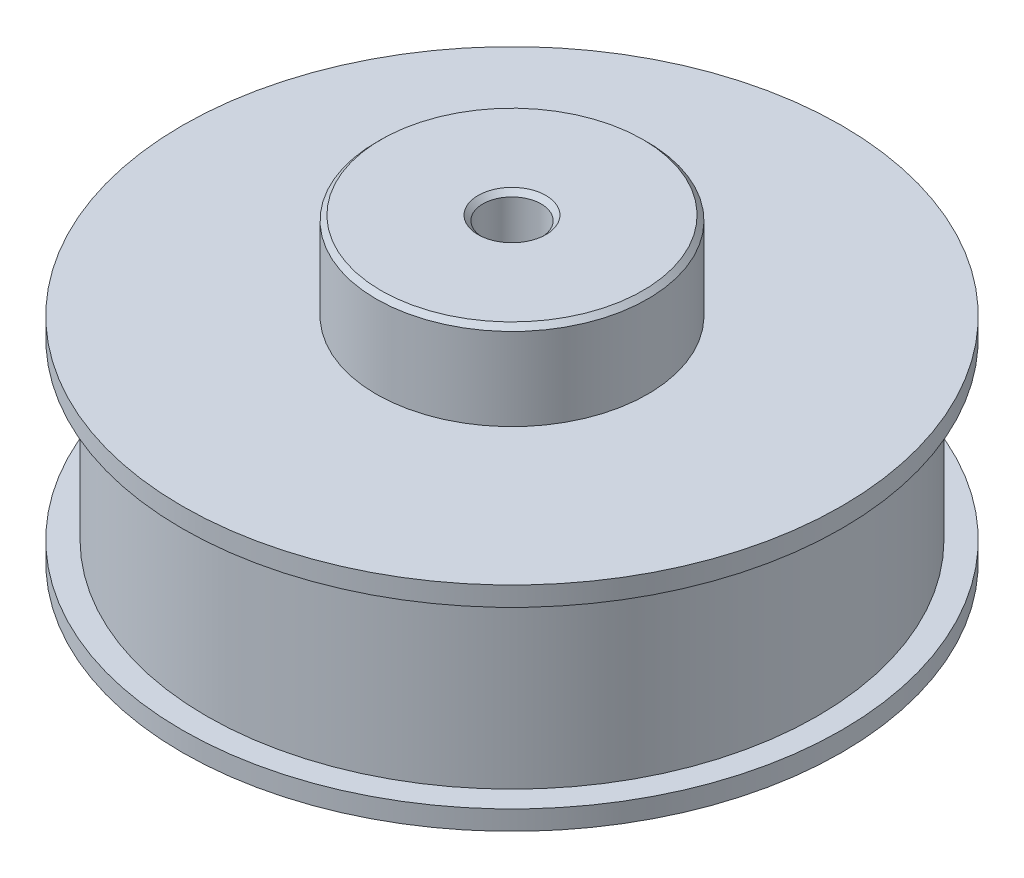
ISO-10303-21;
HEADER;
FILE_DESCRIPTION(('STEP AP214'),'2;1');
FILE_NAME('part.step','',(''),(''),'','','');
FILE_SCHEMA(('AUTOMOTIVE_DESIGN { 1 0 10303 214 1 1 1 1 }'));
ENDSEC;
DATA;
#1=APPLICATION_CONTEXT('core data for automotive mechanical design processes');
#2=APPLICATION_PROTOCOL_DEFINITION('international standard','automotive_design',2000,#1);
#3=PRODUCT_CONTEXT('',#1,'mechanical');
#4=PRODUCT('Part','Part','',(#3));
#5=PRODUCT_RELATED_PRODUCT_CATEGORY('part','',(#4));
#6=PRODUCT_DEFINITION_FORMATION('','',#4);
#7=PRODUCT_DEFINITION_CONTEXT('part definition',#1,'design');
#8=PRODUCT_DEFINITION('design','',#6,#7);
#9=PRODUCT_DEFINITION_SHAPE('','',#8);
#10=(LENGTH_UNIT() NAMED_UNIT(*) SI_UNIT(.MILLI.,.METRE.));
#11=(NAMED_UNIT(*) PLANE_ANGLE_UNIT() SI_UNIT($,.RADIAN.));
#12=(NAMED_UNIT(*) SI_UNIT($,.STERADIAN.) SOLID_ANGLE_UNIT());
#13=UNCERTAINTY_MEASURE_WITH_UNIT(LENGTH_MEASURE(1.E-05),#10,'distance_accuracy_value','');
#14=(GEOMETRIC_REPRESENTATION_CONTEXT(3) GLOBAL_UNCERTAINTY_ASSIGNED_CONTEXT((#13)) GLOBAL_UNIT_ASSIGNED_CONTEXT((#10,
#11,#12)) REPRESENTATION_CONTEXT('',''));
#15=CARTESIAN_POINT('',(0.,0.,0.));
#16=DIRECTION('',(0.,0.,1.));
#17=DIRECTION('',(1.,0.,0.));
#18=AXIS2_PLACEMENT_3D('',#15,#16,#17);
#19=CARTESIAN_POINT('',(0.,22.,0.));
#20=DIRECTION('',(0.,-1.,0.));
#21=DIRECTION('',(0.,0.,-1.));
#22=AXIS2_PLACEMENT_3D('',#19,#20,#21);
#23=CYLINDRICAL_SURFACE('',#22,34.);
#24=CARTESIAN_POINT('',(0.,20.,0.));
#25=DIRECTION('',(0.,1.,0.));
#26=DIRECTION('',(0.,0.,1.));
#27=AXIS2_PLACEMENT_3D('',#24,#25,#26);
#28=CIRCLE('',#27,34.);
#29=CARTESIAN_POINT('',(0.,20.,34.));
#30=VERTEX_POINT('',#29);
#31=EDGE_CURVE('E64',#30,#30,#28,.T.);
#32=ORIENTED_EDGE('',*,*,#31,.T.);
#33=EDGE_LOOP('',(#32));
#34=FACE_BOUND('',#33,.T.);
#35=CARTESIAN_POINT('',(0.,22.,0.));
#36=DIRECTION('',(0.,1.,0.));
#37=DIRECTION('',(0.,0.,1.));
#38=AXIS2_PLACEMENT_3D('',#35,#36,#37);
#39=CIRCLE('',#38,34.);
#40=CARTESIAN_POINT('',(0.,22.,34.));
#41=VERTEX_POINT('',#40);
#42=EDGE_CURVE('E54',#41,#41,#39,.T.);
#43=ORIENTED_EDGE('',*,*,#42,.F.);
#44=EDGE_LOOP('',(#43));
#45=FACE_BOUND('',#44,.T.);
#46=ADVANCED_FACE('F34',(#34,#45),#23,.T.);
#47=CARTESIAN_POINT('',(0.,22.,0.));
#48=DIRECTION('',(0.,1.,0.));
#49=DIRECTION('',(0.,0.,1.));
#50=AXIS2_PLACEMENT_3D('',#47,#48,#49);
#51=PLANE('',#50);
#52=CARTESIAN_POINT('',(0.,22.,0.));
#53=DIRECTION('',(0.,1.,0.));
#54=DIRECTION('',(0.,0.,1.));
#55=AXIS2_PLACEMENT_3D('',#52,#53,#54);
#56=CIRCLE('',#55,14.);
#57=CARTESIAN_POINT('',(0.,22.,14.));
#58=VERTEX_POINT('',#57);
#59=EDGE_CURVE('E70',#58,#58,#56,.T.);
#60=ORIENTED_EDGE('',*,*,#59,.F.);
#61=EDGE_LOOP('',(#60));
#62=FACE_BOUND('',#61,.T.);
#63=ORIENTED_EDGE('',*,*,#42,.T.);
#64=EDGE_LOOP('',(#63));
#65=FACE_BOUND('',#64,.T.);
#66=ADVANCED_FACE('F109',(#62,#65),#51,.T.);
#67=CARTESIAN_POINT('',(0.,20.,0.));
#68=DIRECTION('',(0.,1.,0.));
#69=DIRECTION('',(0.,0.,1.));
#70=AXIS2_PLACEMENT_3D('',#67,#68,#69);
#71=PLANE('',#70);
#72=CARTESIAN_POINT('',(0.,20.,0.));
#73=DIRECTION('',(0.,1.,0.));
#74=DIRECTION('',(0.,0.,1.));
#75=AXIS2_PLACEMENT_3D('',#72,#73,#74);
#76=CIRCLE('',#75,31.5);
#77=CARTESIAN_POINT('',(0.,20.,31.5));
#78=VERTEX_POINT('',#77);
#79=EDGE_CURVE('E67',#78,#78,#76,.T.);
#80=ORIENTED_EDGE('',*,*,#79,.T.);
#81=EDGE_LOOP('',(#80));
#82=FACE_BOUND('',#81,.T.);
#83=ORIENTED_EDGE('',*,*,#31,.F.);
#84=EDGE_LOOP('',(#83));
#85=FACE_BOUND('',#84,.T.);
#86=ADVANCED_FACE('F103',(#82,#85),#71,.F.);
#87=CARTESIAN_POINT('',(0.,-96.1665222413705,0.));
#88=DIRECTION('',(0.,1.,0.));
#89=DIRECTION('',(0.,0.,1.));
#90=AXIS2_PLACEMENT_3D('',#87,#88,#89);
#91=CYLINDRICAL_SURFACE('',#90,31.5);
#92=CARTESIAN_POINT('',(0.,2.,0.));
#93=DIRECTION('',(0.,1.,0.));
#94=DIRECTION('',(0.,0.,1.));
#95=AXIS2_PLACEMENT_3D('',#92,#93,#94);
#96=CIRCLE('',#95,31.5);
#97=CARTESIAN_POINT('',(0.,1.99999999999999,31.5));
#98=VERTEX_POINT('',#97);
#99=EDGE_CURVE('E58',#98,#98,#96,.F.);
#100=CARTESIAN_POINT('',(0.,1.99999999999999,31.5));
#101=CARTESIAN_POINT('',(0.,2.18749999999999,31.5));
#102=CARTESIAN_POINT('',(0.,2.37499999999998,31.5));
#103=CARTESIAN_POINT('',(0.,2.74999999999998,31.5));
#104=CARTESIAN_POINT('',(0.,2.93749999999999,31.5));
#105=CARTESIAN_POINT('',(0.,3.31249999999999,31.5));
#106=CARTESIAN_POINT('',(0.,3.49999999999999,31.5));
#107=CARTESIAN_POINT('',(0.,3.87499999999999,31.5));
#108=CARTESIAN_POINT('',(0.,4.06249999999999,31.5));
#109=CARTESIAN_POINT('',(0.,4.43749999999999,31.5));
#110=CARTESIAN_POINT('',(0.,4.62499999999999,31.5));
#111=CARTESIAN_POINT('',(0.,4.99999999999999,31.5));
#112=CARTESIAN_POINT('',(0.,5.18749999999999,31.5));
#113=CARTESIAN_POINT('',(0.,5.56249999999999,31.5));
#114=CARTESIAN_POINT('',(0.,5.75,31.5));
#115=CARTESIAN_POINT('',(0.,6.125,31.5));
#116=CARTESIAN_POINT('',(0.,6.31249999999999,31.5));
#117=CARTESIAN_POINT('',(0.,6.68749999999999,31.5));
#118=CARTESIAN_POINT('',(0.,6.87499999999999,31.5));
#119=CARTESIAN_POINT('',(0.,7.24999999999999,31.5));
#120=CARTESIAN_POINT('',(0.,7.43749999999999,31.5));
#121=CARTESIAN_POINT('',(0.,7.8125,31.5));
#122=CARTESIAN_POINT('',(0.,8.,31.5));
#123=CARTESIAN_POINT('',(0.,8.375,31.5));
#124=CARTESIAN_POINT('',(0.,8.56249999999999,31.5));
#125=CARTESIAN_POINT('',(0.,8.93749999999999,31.5));
#126=CARTESIAN_POINT('',(0.,9.12499999999999,31.5));
#127=CARTESIAN_POINT('',(0.,9.49999999999999,31.5));
#128=CARTESIAN_POINT('',(0.,9.68749999999999,31.5));
#129=CARTESIAN_POINT('',(0.,10.0625,31.5));
#130=CARTESIAN_POINT('',(0.,10.25,31.5));
#131=CARTESIAN_POINT('',(0.,10.625,31.5));
#132=CARTESIAN_POINT('',(0.,10.8125,31.5));
#133=CARTESIAN_POINT('',(0.,11.1875,31.5));
#134=CARTESIAN_POINT('',(0.,11.375,31.5));
#135=CARTESIAN_POINT('',(0.,11.75,31.5));
#136=CARTESIAN_POINT('',(0.,11.9375,31.5));
#137=CARTESIAN_POINT('',(0.,12.3125,31.5));
#138=CARTESIAN_POINT('',(0.,12.5,31.5));
#139=CARTESIAN_POINT('',(0.,12.875,31.5));
#140=CARTESIAN_POINT('',(0.,13.0625,31.5));
#141=CARTESIAN_POINT('',(0.,13.4375,31.5));
#142=CARTESIAN_POINT('',(0.,13.625,31.5));
#143=CARTESIAN_POINT('',(0.,14.,31.5));
#144=CARTESIAN_POINT('',(0.,14.1875,31.5));
#145=CARTESIAN_POINT('',(0.,14.5625,31.5));
#146=CARTESIAN_POINT('',(0.,14.75,31.5));
#147=CARTESIAN_POINT('',(0.,15.125,31.5));
#148=CARTESIAN_POINT('',(0.,15.3125,31.5));
#149=CARTESIAN_POINT('',(0.,15.6875,31.5));
#150=CARTESIAN_POINT('',(0.,15.875,31.5));
#151=CARTESIAN_POINT('',(0.,16.25,31.5));
#152=CARTESIAN_POINT('',(0.,16.4375,31.5));
#153=CARTESIAN_POINT('',(0.,16.8125,31.5));
#154=CARTESIAN_POINT('',(0.,17.,31.5));
#155=CARTESIAN_POINT('',(0.,17.375,31.5));
#156=CARTESIAN_POINT('',(0.,17.5625,31.5));
#157=CARTESIAN_POINT('',(0.,17.9375,31.5));
#158=CARTESIAN_POINT('',(0.,18.125,31.5));
#159=CARTESIAN_POINT('',(0.,18.5,31.5));
#160=CARTESIAN_POINT('',(0.,18.6875,31.5));
#161=CARTESIAN_POINT('',(0.,19.0625,31.5));
#162=CARTESIAN_POINT('',(0.,19.25,31.5));
#163=CARTESIAN_POINT('',(0.,19.625,31.5));
#164=CARTESIAN_POINT('',(0.,19.8125,31.5));
#165=CARTESIAN_POINT('',(0.,20.,31.5));
#166=B_SPLINE_CURVE_WITH_KNOTS('',3,(#100,#101,#102,#103,#104,#105,#106,#107,#108,#109,#110,
#111,#112,#113,#114,#115,#116,#117,#118,#119,#120,#121,#122,#123,#124,#125,#126,#127,#128,#129,
#130,#131,#132,#133,#134,#135,#136,#137,#138,#139,#140,#141,#142,#143,#144,#145,#146,#147,#148,
#149,#150,#151,#152,#153,#154,#155,#156,#157,#158,#159,#160,#161,#162,#163,#164,#165),
.UNSPECIFIED.,.F.,.F.,(4,2,2,2,2,2,2,2,2,2,2,2,2,2,2,2,2,2,2,2,2,2,2,2,2,2,2,2,2,2,2,2,4),(0.,
0.562499999999994,1.125,1.68750000000001,2.25,2.8125,3.375,3.93750000000001,4.5,5.0625,
5.62500000000001,6.18750000000001,6.75000000000001,7.3125,7.87500000000001,8.43750000000001,
9.00000000000001,9.5625,10.125,10.6875,11.25,11.8125,12.375,12.9375,13.5,14.0625,14.625,15.1875,
15.75,16.3125,16.875,17.4375,18.),.UNSPECIFIED.);
#167=EDGE_CURVE('BSEAM97',#98,#78,#166,.T.);
#168=ORIENTED_EDGE('',*,*,#99,.F.);
#169=ORIENTED_EDGE('',*,*,#79,.F.);
#170=ORIENTED_EDGE('',*,*,#167,.T.);
#171=ORIENTED_EDGE('',*,*,#167,.F.);
#172=EDGE_LOOP('',(#168,#170,#169,#171));
#173=FACE_BOUND('',#172,.T.);
#174=ADVANCED_FACE('F97',(#173),#91,.T.);
#175=CARTESIAN_POINT('',(0.,2.,0.));
#176=DIRECTION('',(0.,1.,0.));
#177=DIRECTION('',(0.,0.,1.));
#178=AXIS2_PLACEMENT_3D('',#175,#176,#177);
#179=PLANE('',#178);
#180=CARTESIAN_POINT('',(0.,2.,0.));
#181=DIRECTION('',(0.,1.,0.));
#182=DIRECTION('',(0.,0.,1.));
#183=AXIS2_PLACEMENT_3D('',#180,#181,#182);
#184=CIRCLE('',#183,34.);
#185=CARTESIAN_POINT('',(0.,2.,34.));
#186=VERTEX_POINT('',#185);
#187=EDGE_CURVE('E63',#186,#186,#184,.F.);
#188=ORIENTED_EDGE('',*,*,#187,.F.);
#189=EDGE_LOOP('',(#188));
#190=FACE_BOUND('',#189,.T.);
#191=ORIENTED_EDGE('',*,*,#99,.T.);
#192=EDGE_LOOP('',(#191));
#193=FACE_BOUND('',#192,.T.);
#194=ADVANCED_FACE('F85',(#190,#193),#179,.T.);
#195=CARTESIAN_POINT('',(0.,0.,0.));
#196=DIRECTION('',(0.,1.,0.));
#197=DIRECTION('',(0.,0.,1.));
#198=AXIS2_PLACEMENT_3D('',#195,#196,#197);
#199=PLANE('',#198);
#200=CARTESIAN_POINT('',(0.,0.,0.));
#201=DIRECTION('',(0.,1.,0.));
#202=DIRECTION('',(0.,0.,1.));
#203=AXIS2_PLACEMENT_3D('',#200,#201,#202);
#204=CIRCLE('',#203,3.);
#205=CARTESIAN_POINT('',(0.,0.,3.));
#206=VERTEX_POINT('',#205);
#207=EDGE_CURVE('E75',#206,#206,#204,.F.);
#208=ORIENTED_EDGE('',*,*,#207,.F.);
#209=EDGE_LOOP('',(#208));
#210=FACE_BOUND('',#209,.T.);
#211=CARTESIAN_POINT('',(0.,0.,0.));
#212=DIRECTION('',(0.,1.,0.));
#213=DIRECTION('',(0.,0.,1.));
#214=AXIS2_PLACEMENT_3D('',#211,#212,#213);
#215=CIRCLE('',#214,34.);
#216=CARTESIAN_POINT('',(0.,0.,34.));
#217=VERTEX_POINT('',#216);
#218=EDGE_CURVE('E55',#217,#217,#215,.T.);
#219=ORIENTED_EDGE('',*,*,#218,.F.);
#220=EDGE_LOOP('',(#219));
#221=FACE_BOUND('',#220,.T.);
#222=ADVANCED_FACE('F81',(#210,#221),#199,.F.);
#223=ORIENTED_EDGE('',*,*,#218,.T.);
#224=EDGE_LOOP('',(#223));
#225=FACE_BOUND('',#224,.T.);
#226=ORIENTED_EDGE('',*,*,#187,.T.);
#227=EDGE_LOOP('',(#226));
#228=FACE_BOUND('',#227,.T.);
#229=ADVANCED_FACE('F84',(#225,#228),#23,.T.);
#230=CARTESIAN_POINT('',(0.,31.,0.));
#231=DIRECTION('',(0.,-1.,0.));
#232=DIRECTION('',(0.,0.,-1.));
#233=AXIS2_PLACEMENT_3D('',#230,#231,#232);
#234=CYLINDRICAL_SURFACE('',#233,14.);
#235=CARTESIAN_POINT('',(0.,30.5,0.));
#236=DIRECTION('',(0.,1.,0.));
#237=DIRECTION('',(0.,0.,1.));
#238=AXIS2_PLACEMENT_3D('',#235,#236,#237);
#239=CIRCLE('',#238,14.);
#240=CARTESIAN_POINT('',(0.,30.5,14.));
#241=VERTEX_POINT('',#240);
#242=EDGE_CURVE('E45',#241,#241,#239,.F.);
#243=ORIENTED_EDGE('',*,*,#242,.T.);
#244=EDGE_LOOP('',(#243));
#245=FACE_BOUND('',#244,.T.);
#246=ORIENTED_EDGE('',*,*,#59,.T.);
#247=EDGE_LOOP('',(#246));
#248=FACE_BOUND('',#247,.T.);
#249=ADVANCED_FACE('F91',(#245,#248),#234,.T.);
#250=CARTESIAN_POINT('',(0.,31.,0.));
#251=DIRECTION('',(0.,1.,0.));
#252=DIRECTION('',(0.,0.,1.));
#253=AXIS2_PLACEMENT_3D('',#250,#251,#252);
#254=PLANE('',#253);
#255=CARTESIAN_POINT('',(0.,31.,0.));
#256=DIRECTION('',(0.,1.,0.));
#257=DIRECTION('',(0.,0.,1.));
#258=AXIS2_PLACEMENT_3D('',#255,#256,#257);
#259=CIRCLE('',#258,3.49999999999999);
#260=CARTESIAN_POINT('',(0.,31.,3.49999999999999));
#261=VERTEX_POINT('',#260);
#262=EDGE_CURVE('E11',#261,#261,#259,.F.);
#263=ORIENTED_EDGE('',*,*,#262,.T.);
#264=EDGE_LOOP('',(#263));
#265=FACE_BOUND('',#264,.T.);
#266=CARTESIAN_POINT('',(0.,31.,0.));
#267=DIRECTION('',(0.,1.,0.));
#268=DIRECTION('',(0.,0.,1.));
#269=AXIS2_PLACEMENT_3D('',#266,#267,#268);
#270=CIRCLE('',#269,13.5);
#271=CARTESIAN_POINT('',(0.,31.,13.5));
#272=VERTEX_POINT('',#271);
#273=EDGE_CURVE('E49',#272,#272,#270,.T.);
#274=ORIENTED_EDGE('',*,*,#273,.T.);
#275=EDGE_LOOP('',(#274));
#276=FACE_BOUND('',#275,.T.);
#277=ADVANCED_FACE('F125',(#265,#276),#254,.T.);
#278=CARTESIAN_POINT('',(0.,31.,0.));
#279=DIRECTION('',(0.,-1.,0.));
#280=DIRECTION('',(0.,0.,-1.));
#281=AXIS2_PLACEMENT_3D('',#278,#279,#280);
#282=CONICAL_SURFACE('',#281,13.5,0.785398163397443);
#283=ORIENTED_EDGE('',*,*,#242,.F.);
#284=EDGE_LOOP('',(#283));
#285=FACE_BOUND('',#284,.T.);
#286=ORIENTED_EDGE('',*,*,#273,.F.);
#287=EDGE_LOOP('',(#286));
#288=FACE_BOUND('',#287,.T.);
#289=ADVANCED_FACE('F123',(#285,#288),#282,.T.);
#290=CARTESIAN_POINT('',(0.,-8.48528137423857,0.));
#291=DIRECTION('',(0.,1.,0.));
#292=DIRECTION('',(0.,0.,1.));
#293=AXIS2_PLACEMENT_3D('',#290,#291,#292);
#294=CYLINDRICAL_SURFACE('',#293,3.);
#295=CARTESIAN_POINT('',(0.,30.5,0.));
#296=DIRECTION('',(0.,1.,0.));
#297=DIRECTION('',(0.,0.,1.));
#298=AXIS2_PLACEMENT_3D('',#295,#296,#297);
#299=CIRCLE('',#298,3.);
#300=CARTESIAN_POINT('',(0.,30.5,3.));
#301=VERTEX_POINT('',#300);
#302=EDGE_CURVE('E41',#301,#301,#299,.T.);
#303=ORIENTED_EDGE('',*,*,#302,.T.);
#304=EDGE_LOOP('',(#303));
#305=FACE_BOUND('',#304,.T.);
#306=ORIENTED_EDGE('',*,*,#207,.T.);
#307=EDGE_LOOP('',(#306));
#308=FACE_BOUND('',#307,.T.);
#309=ADVANCED_FACE('F79',(#305,#308),#294,.F.);
#310=CARTESIAN_POINT('',(0.,30.5,0.));
#311=DIRECTION('',(0.,1.,0.));
#312=DIRECTION('',(0.,0.,1.));
#313=AXIS2_PLACEMENT_3D('',#310,#311,#312);
#314=CONICAL_SURFACE('',#313,3.,0.785398163397444);
#315=ORIENTED_EDGE('',*,*,#262,.F.);
#316=EDGE_LOOP('',(#315));
#317=FACE_BOUND('',#316,.T.);
#318=ORIENTED_EDGE('',*,*,#302,.F.);
#319=EDGE_LOOP('',(#318));
#320=FACE_BOUND('',#319,.T.);
#321=ADVANCED_FACE('F36',(#317,#320),#314,.F.);
#322=CLOSED_SHELL('',(#46,#66,#86,#174,#194,#222,#229,#249,#277,#289,#309,#321));
#323=MANIFOLD_SOLID_BREP('B2',#322);
#324=ADVANCED_BREP_SHAPE_REPRESENTATION('',(#18,#323),#14);
#325=SHAPE_DEFINITION_REPRESENTATION(#9,#324);
ENDSEC;
END-ISO-10303-21;
